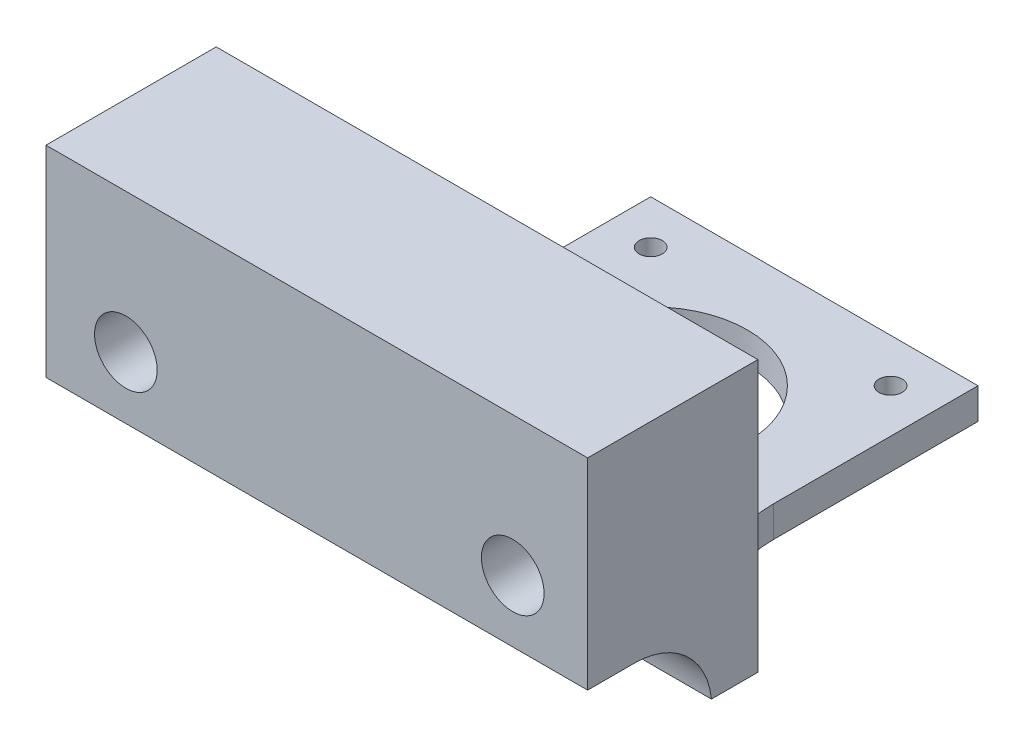
ISO-10303-21;
HEADER;
FILE_DESCRIPTION(('STEP AP214'),'2;1');
FILE_NAME('part.step','',(''),(''),'','','');
FILE_SCHEMA(('AUTOMOTIVE_DESIGN { 1 0 10303 214 1 1 1 1 }'));
ENDSEC;
DATA;
#1=APPLICATION_CONTEXT('core data for automotive mechanical design processes');
#2=APPLICATION_PROTOCOL_DEFINITION('international standard','automotive_design',2000,#1);
#3=PRODUCT_CONTEXT('',#1,'mechanical');
#4=PRODUCT('Part','Part','',(#3));
#5=PRODUCT_RELATED_PRODUCT_CATEGORY('part','',(#4));
#6=PRODUCT_DEFINITION_FORMATION('','',#4);
#7=PRODUCT_DEFINITION_CONTEXT('part definition',#1,'design');
#8=PRODUCT_DEFINITION('design','',#6,#7);
#9=PRODUCT_DEFINITION_SHAPE('','',#8);
#10=(LENGTH_UNIT() NAMED_UNIT(*) SI_UNIT(.MILLI.,.METRE.));
#11=(NAMED_UNIT(*) PLANE_ANGLE_UNIT() SI_UNIT($,.RADIAN.));
#12=(NAMED_UNIT(*) SI_UNIT($,.STERADIAN.) SOLID_ANGLE_UNIT());
#13=UNCERTAINTY_MEASURE_WITH_UNIT(LENGTH_MEASURE(1.E-05),#10,'distance_accuracy_value','');
#14=(GEOMETRIC_REPRESENTATION_CONTEXT(3) GLOBAL_UNCERTAINTY_ASSIGNED_CONTEXT((#13)) GLOBAL_UNIT_ASSIGNED_CONTEXT((#10,
#11,#12)) REPRESENTATION_CONTEXT('',''));
#15=CARTESIAN_POINT('',(0.,0.,0.));
#16=DIRECTION('',(0.,0.,1.));
#17=DIRECTION('',(1.,0.,0.));
#18=AXIS2_PLACEMENT_3D('',#15,#16,#17);
#19=CARTESIAN_POINT('',(0.,4.,0.));
#20=DIRECTION('',(0.,1.,0.));
#21=DIRECTION('',(0.,0.,1.));
#22=AXIS2_PLACEMENT_3D('',#19,#20,#21);
#23=PLANE('',#22);
#24=CARTESIAN_POINT('',(-15.5,4.,15.5));
#25=DIRECTION('',(0.,1.,0.));
#26=DIRECTION('',(0.,0.,1.));
#27=AXIS2_PLACEMENT_3D('',#24,#25,#26);
#28=CIRCLE('',#27,1.5);
#29=CARTESIAN_POINT('',(-15.5,4.,17.));
#30=VERTEX_POINT('',#29);
#31=EDGE_CURVE('E360',#30,#30,#28,.T.);
#32=ORIENTED_EDGE('',*,*,#31,.F.);
#33=EDGE_LOOP('',(#32));
#34=FACE_BOUND('',#33,.T.);
#35=CARTESIAN_POINT('',(-15.5,4.,-15.5));
#36=DIRECTION('',(0.,1.,0.));
#37=DIRECTION('',(0.,0.,1.));
#38=AXIS2_PLACEMENT_3D('',#35,#36,#37);
#39=CIRCLE('',#38,1.5);
#40=CARTESIAN_POINT('',(-15.5,4.,-14.));
#41=VERTEX_POINT('',#40);
#42=EDGE_CURVE('E372',#41,#41,#39,.T.);
#43=ORIENTED_EDGE('',*,*,#42,.F.);
#44=EDGE_LOOP('',(#43));
#45=FACE_BOUND('',#44,.T.);
#46=CARTESIAN_POINT('',(-37.15,4.,5.29511116406048));
#47=DIRECTION('',(0.,1.,0.));
#48=DIRECTION('',(0.,0.,1.));
#49=AXIS2_PLACEMENT_3D('',#46,#47,#48);
#50=CIRCLE('',#49,16.);
#51=CARTESIAN_POINT('',(-21.15,4.,5.29511116406048));
#52=VERTEX_POINT('',#51);
#53=CARTESIAN_POINT('',(-29.1473719726731,4.,19.15));
#54=VERTEX_POINT('',#53);
#55=EDGE_CURVE('E258',#52,#54,#50,.F.);
#56=ORIENTED_EDGE('',*,*,#55,.T.);
#57=DIRECTION('',(1.,0.,0.));
#58=VECTOR('',#57,1.);
#59=CARTESIAN_POINT('',(0.,4.,19.15));
#60=LINE('',#59,#58);
#61=CARTESIAN_POINT('',(29.1473719726731,4.,19.15));
#62=VERTEX_POINT('',#61);
#63=EDGE_CURVE('E266',#54,#62,#60,.T.);
#64=ORIENTED_EDGE('',*,*,#63,.T.);
#65=CARTESIAN_POINT('',(37.15,4.,5.29511116406048));
#66=DIRECTION('',(0.,1.,0.));
#67=DIRECTION('',(0.,0.,1.));
#68=AXIS2_PLACEMENT_3D('',#65,#66,#67);
#69=CIRCLE('',#68,16.);
#70=CARTESIAN_POINT('',(21.15,4.,5.29511116406048));
#71=VERTEX_POINT('',#70);
#72=EDGE_CURVE('E254',#62,#71,#69,.F.);
#73=ORIENTED_EDGE('',*,*,#72,.T.);
#74=DIRECTION('',(0.,0.,1.));
#75=VECTOR('',#74,1.);
#76=CARTESIAN_POINT('',(21.15,4.,-21.15));
#77=LINE('',#76,#75);
#78=CARTESIAN_POINT('',(21.15,4.,-21.15));
#79=VERTEX_POINT('',#78);
#80=EDGE_CURVE('E322',#79,#71,#77,.T.);
#81=ORIENTED_EDGE('',*,*,#80,.F.);
#82=DIRECTION('',(1.,0.,0.));
#83=VECTOR('',#82,1.);
#84=CARTESIAN_POINT('',(-21.15,4.,-21.15));
#85=LINE('',#84,#83);
#86=CARTESIAN_POINT('',(-21.15,4.,-21.15));
#87=VERTEX_POINT('',#86);
#88=EDGE_CURVE('E329',#87,#79,#85,.T.);
#89=ORIENTED_EDGE('',*,*,#88,.F.);
#90=DIRECTION('',(0.,0.,1.));
#91=VECTOR('',#90,1.);
#92=CARTESIAN_POINT('',(-21.15,4.,-21.15));
#93=LINE('',#92,#91);
#94=EDGE_CURVE('E330',#87,#52,#93,.T.);
#95=ORIENTED_EDGE('',*,*,#94,.T.);
#96=EDGE_LOOP('',(#56,#64,#73,#81,#89,#95));
#97=FACE_BOUND('',#96,.T.);
#98=CARTESIAN_POINT('',(0.,4.,0.));
#99=DIRECTION('',(0.,1.,0.));
#100=DIRECTION('',(0.,0.,1.));
#101=AXIS2_PLACEMENT_3D('',#98,#99,#100);
#102=CIRCLE('',#101,12.5);
#103=CARTESIAN_POINT('',(0.,4.,12.5));
#104=VERTEX_POINT('',#103);
#105=EDGE_CURVE('E378',#104,#104,#102,.T.);
#106=ORIENTED_EDGE('',*,*,#105,.F.);
#107=EDGE_LOOP('',(#106));
#108=FACE_BOUND('',#107,.T.);
#109=CARTESIAN_POINT('',(15.5,4.,15.5));
#110=DIRECTION('',(0.,1.,0.));
#111=DIRECTION('',(0.,0.,1.));
#112=AXIS2_PLACEMENT_3D('',#109,#110,#111);
#113=CIRCLE('',#112,1.5);
#114=CARTESIAN_POINT('',(15.5,4.,17.));
#115=VERTEX_POINT('',#114);
#116=EDGE_CURVE('E366',#115,#115,#113,.T.);
#117=ORIENTED_EDGE('',*,*,#116,.F.);
#118=EDGE_LOOP('',(#117));
#119=FACE_BOUND('',#118,.T.);
#120=CARTESIAN_POINT('',(15.5,4.,-15.5));
#121=DIRECTION('',(0.,1.,0.));
#122=DIRECTION('',(0.,0.,1.));
#123=AXIS2_PLACEMENT_3D('',#120,#121,#122);
#124=CIRCLE('',#123,1.5);
#125=CARTESIAN_POINT('',(15.5,4.,-14.));
#126=VERTEX_POINT('',#125);
#127=EDGE_CURVE('E354',#126,#126,#124,.T.);
#128=ORIENTED_EDGE('',*,*,#127,.F.);
#129=EDGE_LOOP('',(#128));
#130=FACE_BOUND('',#129,.T.);
#131=ADVANCED_FACE('F110',(#34,#45,#97,#108,#119,#130),#23,.T.);
#132=CARTESIAN_POINT('',(0.,0.,0.));
#133=DIRECTION('',(0.,1.,0.));
#134=DIRECTION('',(0.,0.,1.));
#135=AXIS2_PLACEMENT_3D('',#132,#133,#134);
#136=PLANE('',#135);
#137=CARTESIAN_POINT('',(-15.5,0.,15.5));
#138=DIRECTION('',(0.,1.,0.));
#139=DIRECTION('',(0.,0.,1.));
#140=AXIS2_PLACEMENT_3D('',#137,#138,#139);
#141=CIRCLE('',#140,1.5);
#142=CARTESIAN_POINT('',(-15.5,0.,17.));
#143=VERTEX_POINT('',#142);
#144=EDGE_CURVE('E357',#143,#143,#141,.T.);
#145=ORIENTED_EDGE('',*,*,#144,.T.);
#146=EDGE_LOOP('',(#145));
#147=FACE_BOUND('',#146,.T.);
#148=CARTESIAN_POINT('',(-15.5,0.,-15.5));
#149=DIRECTION('',(0.,1.,0.));
#150=DIRECTION('',(0.,0.,1.));
#151=AXIS2_PLACEMENT_3D('',#148,#149,#150);
#152=CIRCLE('',#151,1.5);
#153=CARTESIAN_POINT('',(-15.5,0.,-14.));
#154=VERTEX_POINT('',#153);
#155=EDGE_CURVE('E369',#154,#154,#152,.T.);
#156=ORIENTED_EDGE('',*,*,#155,.T.);
#157=EDGE_LOOP('',(#156));
#158=FACE_BOUND('',#157,.T.);
#159=DIRECTION('',(0.,0.,1.));
#160=VECTOR('',#159,1.);
#161=CARTESIAN_POINT('',(-21.15,0.,-21.15));
#162=LINE('',#161,#160);
#163=CARTESIAN_POINT('',(-21.15,0.,-21.15));
#164=VERTEX_POINT('',#163);
#165=CARTESIAN_POINT('',(-21.15,0.,5.29511116406048));
#166=VERTEX_POINT('',#165);
#167=EDGE_CURVE('E381',#164,#166,#162,.T.);
#168=ORIENTED_EDGE('',*,*,#167,.F.);
#169=DIRECTION('',(1.,0.,0.));
#170=VECTOR('',#169,1.);
#171=CARTESIAN_POINT('',(-21.15,0.,-21.15));
#172=LINE('',#171,#170);
#173=CARTESIAN_POINT('',(21.15,0.,-21.15));
#174=VERTEX_POINT('',#173);
#175=EDGE_CURVE('E385',#164,#174,#172,.T.);
#176=ORIENTED_EDGE('',*,*,#175,.T.);
#177=DIRECTION('',(0.,0.,1.));
#178=VECTOR('',#177,1.);
#179=CARTESIAN_POINT('',(21.15,0.,-21.15));
#180=LINE('',#179,#178);
#181=CARTESIAN_POINT('',(21.15,0.,5.29511116406048));
#182=VERTEX_POINT('',#181);
#183=EDGE_CURVE('E341',#174,#182,#180,.T.);
#184=ORIENTED_EDGE('',*,*,#183,.T.);
#185=CARTESIAN_POINT('',(37.15,0.,5.29511116406048));
#186=DIRECTION('',(0.,1.,0.));
#187=DIRECTION('',(0.,0.,1.));
#188=AXIS2_PLACEMENT_3D('',#185,#186,#187);
#189=CIRCLE('',#188,16.);
#190=CARTESIAN_POINT('',(35.,0.,21.15));
#191=VERTEX_POINT('',#190);
#192=EDGE_CURVE('E252',#182,#191,#189,.T.);
#193=ORIENTED_EDGE('',*,*,#192,.T.);
#194=DIRECTION('',(0.,0.,-1.));
#195=VECTOR('',#194,1.);
#196=CARTESIAN_POINT('',(35.,0.,27.15));
#197=LINE('',#196,#195);
#198=CARTESIAN_POINT('',(35.,0.,27.15));
#199=VERTEX_POINT('',#198);
#200=EDGE_CURVE('E338',#199,#191,#197,.T.);
#201=ORIENTED_EDGE('',*,*,#200,.F.);
#202=DIRECTION('',(1.,0.,0.));
#203=VECTOR('',#202,1.);
#204=CARTESIAN_POINT('',(0.,0.,27.15));
#205=LINE('',#204,#203);
#206=CARTESIAN_POINT('',(-35.,0.,27.15));
#207=VERTEX_POINT('',#206);
#208=EDGE_CURVE('E413',#207,#199,#205,.T.);
#209=ORIENTED_EDGE('',*,*,#208,.F.);
#210=DIRECTION('',(0.,0.,-1.));
#211=VECTOR('',#210,1.);
#212=CARTESIAN_POINT('',(-35.,0.,27.15));
#213=LINE('',#212,#211);
#214=CARTESIAN_POINT('',(-35.,0.,21.15));
#215=VERTEX_POINT('',#214);
#216=EDGE_CURVE('E343',#207,#215,#213,.T.);
#217=ORIENTED_EDGE('',*,*,#216,.T.);
#218=CARTESIAN_POINT('',(-37.15,0.,5.29511116406048));
#219=DIRECTION('',(0.,1.,0.));
#220=DIRECTION('',(0.,0.,1.));
#221=AXIS2_PLACEMENT_3D('',#218,#219,#220);
#222=CIRCLE('',#221,16.);
#223=EDGE_CURVE('E256',#215,#166,#222,.T.);
#224=ORIENTED_EDGE('',*,*,#223,.T.);
#225=EDGE_LOOP('',(#168,#176,#184,#193,#201,#209,#217,#224));
#226=FACE_BOUND('',#225,.T.);
#227=CARTESIAN_POINT('',(0.,0.,0.));
#228=DIRECTION('',(0.,1.,0.));
#229=DIRECTION('',(0.,0.,1.));
#230=AXIS2_PLACEMENT_3D('',#227,#228,#229);
#231=CIRCLE('',#230,12.5);
#232=CARTESIAN_POINT('',(0.,0.,12.5));
#233=VERTEX_POINT('',#232);
#234=EDGE_CURVE('E375',#233,#233,#231,.T.);
#235=ORIENTED_EDGE('',*,*,#234,.T.);
#236=EDGE_LOOP('',(#235));
#237=FACE_BOUND('',#236,.T.);
#238=CARTESIAN_POINT('',(15.5,0.,15.5));
#239=DIRECTION('',(0.,1.,0.));
#240=DIRECTION('',(0.,0.,1.));
#241=AXIS2_PLACEMENT_3D('',#238,#239,#240);
#242=CIRCLE('',#241,1.5);
#243=CARTESIAN_POINT('',(15.5,0.,17.));
#244=VERTEX_POINT('',#243);
#245=EDGE_CURVE('E363',#244,#244,#242,.T.);
#246=ORIENTED_EDGE('',*,*,#245,.T.);
#247=EDGE_LOOP('',(#246));
#248=FACE_BOUND('',#247,.T.);
#249=CARTESIAN_POINT('',(15.5,0.,-15.5));
#250=DIRECTION('',(0.,1.,0.));
#251=DIRECTION('',(0.,0.,1.));
#252=AXIS2_PLACEMENT_3D('',#249,#250,#251);
#253=CIRCLE('',#252,1.5);
#254=CARTESIAN_POINT('',(15.5,0.,-14.));
#255=VERTEX_POINT('',#254);
#256=EDGE_CURVE('E347',#255,#255,#253,.T.);
#257=ORIENTED_EDGE('',*,*,#256,.T.);
#258=EDGE_LOOP('',(#257));
#259=FACE_BOUND('',#258,.T.);
#260=ADVANCED_FACE('F296',(#147,#158,#226,#237,#248,#259),#136,.F.);
#261=CARTESIAN_POINT('',(-21.15,4.,-21.15));
#262=DIRECTION('',(1.,0.,0.));
#263=DIRECTION('',(0.,0.,-1.));
#264=AXIS2_PLACEMENT_3D('',#261,#262,#263);
#265=PLANE('',#264);
#266=ORIENTED_EDGE('',*,*,#167,.T.);
#267=DIRECTION('',(0.,-1.,0.));
#268=VECTOR('',#267,1.);
#269=CARTESIAN_POINT('',(-21.15,4.,5.29511116406048));
#270=LINE('',#269,#268);
#271=EDGE_CURVE('E249',#166,#52,#270,.F.);
#272=ORIENTED_EDGE('',*,*,#271,.T.);
#273=ORIENTED_EDGE('',*,*,#94,.F.);
#274=DIRECTION('',(0.,-1.,0.));
#275=VECTOR('',#274,1.);
#276=CARTESIAN_POINT('',(-21.15,4.,-21.15));
#277=LINE('',#276,#275);
#278=EDGE_CURVE('E388',#87,#164,#277,.T.);
#279=ORIENTED_EDGE('',*,*,#278,.T.);
#280=EDGE_LOOP('',(#266,#272,#273,#279));
#281=FACE_BOUND('',#280,.T.);
#282=ADVANCED_FACE('F283',(#281),#265,.F.);
#283=CARTESIAN_POINT('',(21.15,4.,-21.15));
#284=DIRECTION('',(1.,0.,0.));
#285=DIRECTION('',(0.,0.,-1.));
#286=AXIS2_PLACEMENT_3D('',#283,#284,#285);
#287=PLANE('',#286);
#288=ORIENTED_EDGE('',*,*,#80,.T.);
#289=DIRECTION('',(0.,1.,0.));
#290=VECTOR('',#289,1.);
#291=CARTESIAN_POINT('',(21.15,0.,5.29511116406048));
#292=LINE('',#291,#290);
#293=EDGE_CURVE('E246',#71,#182,#292,.F.);
#294=ORIENTED_EDGE('',*,*,#293,.T.);
#295=ORIENTED_EDGE('',*,*,#183,.F.);
#296=DIRECTION('',(0.,-1.,0.));
#297=VECTOR('',#296,1.);
#298=CARTESIAN_POINT('',(21.15,4.,-21.15));
#299=LINE('',#298,#297);
#300=EDGE_CURVE('E250',#79,#174,#299,.T.);
#301=ORIENTED_EDGE('',*,*,#300,.F.);
#302=EDGE_LOOP('',(#288,#294,#295,#301));
#303=FACE_BOUND('',#302,.T.);
#304=ADVANCED_FACE('F312',(#303),#287,.T.);
#305=CARTESIAN_POINT('',(-21.15,4.,-21.15));
#306=DIRECTION('',(0.,0.,-1.));
#307=DIRECTION('',(-1.,0.,0.));
#308=AXIS2_PLACEMENT_3D('',#305,#306,#307);
#309=PLANE('',#308);
#310=ORIENTED_EDGE('',*,*,#175,.F.);
#311=ORIENTED_EDGE('',*,*,#278,.F.);
#312=ORIENTED_EDGE('',*,*,#88,.T.);
#313=ORIENTED_EDGE('',*,*,#300,.T.);
#314=EDGE_LOOP('',(#310,#311,#312,#313));
#315=FACE_BOUND('',#314,.T.);
#316=ADVANCED_FACE('F310',(#315),#309,.T.);
#317=CARTESIAN_POINT('',(0.,4.,0.));
#318=DIRECTION('',(0.,-1.,0.));
#319=DIRECTION('',(0.,0.,-1.));
#320=AXIS2_PLACEMENT_3D('',#317,#318,#319);
#321=CYLINDRICAL_SURFACE('',#320,12.5);
#322=ORIENTED_EDGE('',*,*,#105,.T.);
#323=EDGE_LOOP('',(#322));
#324=FACE_BOUND('',#323,.T.);
#325=ORIENTED_EDGE('',*,*,#234,.F.);
#326=EDGE_LOOP('',(#325));
#327=FACE_BOUND('',#326,.T.);
#328=ADVANCED_FACE('F307',(#324,#327),#321,.F.);
#329=CARTESIAN_POINT('',(-15.5,4.,-15.5));
#330=DIRECTION('',(0.,-1.,0.));
#331=DIRECTION('',(0.,0.,-1.));
#332=AXIS2_PLACEMENT_3D('',#329,#330,#331);
#333=CYLINDRICAL_SURFACE('',#332,1.5);
#334=ORIENTED_EDGE('',*,*,#42,.T.);
#335=EDGE_LOOP('',(#334));
#336=FACE_BOUND('',#335,.T.);
#337=ORIENTED_EDGE('',*,*,#155,.F.);
#338=EDGE_LOOP('',(#337));
#339=FACE_BOUND('',#338,.T.);
#340=ADVANCED_FACE('F459',(#336,#339),#333,.F.);
#341=CARTESIAN_POINT('',(15.5,4.,15.5));
#342=DIRECTION('',(0.,-1.,0.));
#343=DIRECTION('',(0.,0.,-1.));
#344=AXIS2_PLACEMENT_3D('',#341,#342,#343);
#345=CYLINDRICAL_SURFACE('',#344,1.5);
#346=ORIENTED_EDGE('',*,*,#116,.T.);
#347=EDGE_LOOP('',(#346));
#348=FACE_BOUND('',#347,.T.);
#349=ORIENTED_EDGE('',*,*,#245,.F.);
#350=EDGE_LOOP('',(#349));
#351=FACE_BOUND('',#350,.T.);
#352=ADVANCED_FACE('F456',(#348,#351),#345,.F.);
#353=CARTESIAN_POINT('',(-15.5,4.,15.5));
#354=DIRECTION('',(0.,-1.,0.));
#355=DIRECTION('',(0.,0.,-1.));
#356=AXIS2_PLACEMENT_3D('',#353,#354,#355);
#357=CYLINDRICAL_SURFACE('',#356,1.5);
#358=ORIENTED_EDGE('',*,*,#31,.T.);
#359=EDGE_LOOP('',(#358));
#360=FACE_BOUND('',#359,.T.);
#361=ORIENTED_EDGE('',*,*,#144,.F.);
#362=EDGE_LOOP('',(#361));
#363=FACE_BOUND('',#362,.T.);
#364=ADVANCED_FACE('F452',(#360,#363),#357,.F.);
#365=CARTESIAN_POINT('',(15.5,4.,-15.5));
#366=DIRECTION('',(0.,-1.,0.));
#367=DIRECTION('',(0.,0.,-1.));
#368=AXIS2_PLACEMENT_3D('',#365,#366,#367);
#369=CYLINDRICAL_SURFACE('',#368,1.5);
#370=ORIENTED_EDGE('',*,*,#127,.T.);
#371=EDGE_LOOP('',(#370));
#372=FACE_BOUND('',#371,.T.);
#373=ORIENTED_EDGE('',*,*,#256,.F.);
#374=EDGE_LOOP('',(#373));
#375=FACE_BOUND('',#374,.T.);
#376=ADVANCED_FACE('F449',(#372,#375),#369,.F.);
#377=CARTESIAN_POINT('',(-35.,0.,27.15));
#378=DIRECTION('',(-1.,0.,0.));
#379=DIRECTION('',(0.,-1.,0.));
#380=AXIS2_PLACEMENT_3D('',#377,#378,#379);
#381=PLANE('',#380);
#382=DIRECTION('',(0.,1.,0.));
#383=VECTOR('',#382,1.);
#384=CARTESIAN_POINT('',(-35.,0.,21.15));
#385=LINE('',#384,#383);
#386=CARTESIAN_POINT('',(-35.,6.,21.15));
#387=VERTEX_POINT('',#386);
#388=EDGE_CURVE('E231',#215,#387,#385,.T.);
#389=ORIENTED_EDGE('',*,*,#388,.F.);
#390=ORIENTED_EDGE('',*,*,#216,.F.);
#391=CARTESIAN_POINT('',(-35.,-0.999999999999996,37.0998743710662));
#392=DIRECTION('',(-1.,0.,0.));
#393=DIRECTION('',(0.,-1.,0.));
#394=AXIS2_PLACEMENT_3D('',#391,#392,#393);
#395=CIRCLE('',#394,10.);
#396=CARTESIAN_POINT('',(-35.,9.00000000000001,37.0998743710662));
#397=VERTEX_POINT('',#396);
#398=EDGE_CURVE('E228',#207,#397,#395,.F.);
#399=ORIENTED_EDGE('',*,*,#398,.T.);
#400=DIRECTION('',(0.,0.,-1.));
#401=VECTOR('',#400,1.);
#402=CARTESIAN_POINT('',(-35.,9.00000000000001,43.15));
#403=LINE('',#402,#401);
#404=CARTESIAN_POINT('',(-35.,9.00000000000001,43.15));
#405=VERTEX_POINT('',#404);
#406=EDGE_CURVE('E205',#405,#397,#403,.T.);
#407=ORIENTED_EDGE('',*,*,#406,.F.);
#408=DIRECTION('',(0.,-1.,0.));
#409=VECTOR('',#408,1.);
#410=CARTESIAN_POINT('',(-35.,35.,43.15));
#411=LINE('',#410,#409);
#412=CARTESIAN_POINT('',(-35.,35.,43.15));
#413=VERTEX_POINT('',#412);
#414=EDGE_CURVE('E213',#413,#405,#411,.T.);
#415=ORIENTED_EDGE('',*,*,#414,.F.);
#416=DIRECTION('',(0.,0.,-1.));
#417=VECTOR('',#416,1.);
#418=CARTESIAN_POINT('',(-35.,35.,27.15));
#419=LINE('',#418,#417);
#420=CARTESIAN_POINT('',(-35.,35.,21.15));
#421=VERTEX_POINT('',#420);
#422=EDGE_CURVE('E350',#413,#421,#419,.T.);
#423=ORIENTED_EDGE('',*,*,#422,.T.);
#424=EDGE_CURVE('E229',#387,#421,#385,.T.);
#425=ORIENTED_EDGE('',*,*,#424,.F.);
#426=EDGE_LOOP('',(#389,#390,#399,#407,#415,#423,#425));
#427=FACE_BOUND('',#426,.T.);
#428=ADVANCED_FACE('F226',(#427),#381,.T.);
#429=CARTESIAN_POINT('',(35.,0.,27.15));
#430=DIRECTION('',(-1.,0.,0.));
#431=DIRECTION('',(0.,0.,1.));
#432=AXIS2_PLACEMENT_3D('',#429,#430,#431);
#433=PLANE('',#432);
#434=DIRECTION('',(0.,1.,0.));
#435=VECTOR('',#434,1.);
#436=CARTESIAN_POINT('',(35.,0.,21.15));
#437=LINE('',#436,#435);
#438=CARTESIAN_POINT('',(35.,6.,21.15));
#439=VERTEX_POINT('',#438);
#440=EDGE_CURVE('E130',#191,#439,#437,.T.);
#441=ORIENTED_EDGE('',*,*,#440,.T.);
#442=CARTESIAN_POINT('',(35.,35.,21.15));
#443=VERTEX_POINT('',#442);
#444=EDGE_CURVE('E410',#439,#443,#437,.T.);
#445=ORIENTED_EDGE('',*,*,#444,.T.);
#446=DIRECTION('',(0.,0.,-1.));
#447=VECTOR('',#446,1.);
#448=CARTESIAN_POINT('',(35.,35.,27.15));
#449=LINE('',#448,#447);
#450=CARTESIAN_POINT('',(35.,35.,43.15));
#451=VERTEX_POINT('',#450);
#452=EDGE_CURVE('E344',#451,#443,#449,.T.);
#453=ORIENTED_EDGE('',*,*,#452,.F.);
#454=DIRECTION('',(0.,1.,0.));
#455=VECTOR('',#454,1.);
#456=CARTESIAN_POINT('',(35.,35.,43.15));
#457=LINE('',#456,#455);
#458=CARTESIAN_POINT('',(35.,9.00000000000001,43.15));
#459=VERTEX_POINT('',#458);
#460=EDGE_CURVE('E212',#459,#451,#457,.T.);
#461=ORIENTED_EDGE('',*,*,#460,.F.);
#462=DIRECTION('',(0.,0.,-1.));
#463=VECTOR('',#462,1.);
#464=CARTESIAN_POINT('',(35.,9.00000000000001,43.15));
#465=LINE('',#464,#463);
#466=CARTESIAN_POINT('',(35.,9.00000000000001,37.0998743710662));
#467=VERTEX_POINT('',#466);
#468=EDGE_CURVE('E208',#459,#467,#465,.T.);
#469=ORIENTED_EDGE('',*,*,#468,.T.);
#470=CARTESIAN_POINT('',(35.,-0.999999999999996,37.0998743710662));
#471=DIRECTION('',(-1.,0.,0.));
#472=DIRECTION('',(0.,0.,1.));
#473=AXIS2_PLACEMENT_3D('',#470,#471,#472);
#474=CIRCLE('',#473,10.);
#475=EDGE_CURVE('E263',#467,#199,#474,.T.);
#476=ORIENTED_EDGE('',*,*,#475,.T.);
#477=ORIENTED_EDGE('',*,*,#200,.T.);
#478=EDGE_LOOP('',(#441,#445,#453,#461,#469,#476,#477));
#479=FACE_BOUND('',#478,.T.);
#480=ADVANCED_FACE('F342',(#479),#433,.F.);
#481=CARTESIAN_POINT('',(0.,35.,27.15));
#482=DIRECTION('',(0.,1.,0.));
#483=DIRECTION('',(0.,0.,1.));
#484=AXIS2_PLACEMENT_3D('',#481,#482,#483);
#485=PLANE('',#484);
#486=DIRECTION('',(1.,0.,0.));
#487=VECTOR('',#486,1.);
#488=CARTESIAN_POINT('',(0.,35.,21.15));
#489=LINE('',#488,#487);
#490=EDGE_CURVE('E414',#421,#443,#489,.T.);
#491=ORIENTED_EDGE('',*,*,#490,.F.);
#492=ORIENTED_EDGE('',*,*,#422,.F.);
#493=DIRECTION('',(-1.,0.,0.));
#494=VECTOR('',#493,1.);
#495=CARTESIAN_POINT('',(-35.,35.,43.15));
#496=LINE('',#495,#494);
#497=EDGE_CURVE('E220',#451,#413,#496,.T.);
#498=ORIENTED_EDGE('',*,*,#497,.F.);
#499=ORIENTED_EDGE('',*,*,#452,.T.);
#500=EDGE_LOOP('',(#491,#492,#498,#499));
#501=FACE_BOUND('',#500,.T.);
#502=ADVANCED_FACE('F415',(#501),#485,.T.);
#503=CARTESIAN_POINT('',(0.,0.,21.15));
#504=DIRECTION('',(0.,0.,1.));
#505=DIRECTION('',(1.,0.,0.));
#506=AXIS2_PLACEMENT_3D('',#503,#504,#505);
#507=PLANE('',#506);
#508=CARTESIAN_POINT('',(25.3209634714259,17.,21.15));
#509=DIRECTION('',(0.,0.,1.));
#510=DIRECTION('',(1.,0.,0.));
#511=AXIS2_PLACEMENT_3D('',#508,#509,#510);
#512=CIRCLE('',#511,4.05);
#513=CARTESIAN_POINT('',(29.3709634714259,17.,21.15));
#514=VERTEX_POINT('',#513);
#515=EDGE_CURVE('E243',#514,#514,#512,.T.);
#516=ORIENTED_EDGE('',*,*,#515,.T.);
#517=EDGE_LOOP('',(#516));
#518=FACE_BOUND('',#517,.T.);
#519=CARTESIAN_POINT('',(-24.6790365285741,17.,21.15));
#520=DIRECTION('',(0.,0.,1.));
#521=DIRECTION('',(1.,0.,0.));
#522=AXIS2_PLACEMENT_3D('',#519,#520,#521);
#523=CIRCLE('',#522,4.05);
#524=CARTESIAN_POINT('',(-20.6290365285741,17.,21.15));
#525=VERTEX_POINT('',#524);
#526=EDGE_CURVE('E239',#525,#525,#523,.T.);
#527=ORIENTED_EDGE('',*,*,#526,.T.);
#528=EDGE_LOOP('',(#527));
#529=FACE_BOUND('',#528,.T.);
#530=ORIENTED_EDGE('',*,*,#444,.F.);
#531=DIRECTION('',(1.,0.,0.));
#532=VECTOR('',#531,1.);
#533=CARTESIAN_POINT('',(0.,6.,21.15));
#534=LINE('',#533,#532);
#535=EDGE_CURVE('E269',#439,#387,#534,.F.);
#536=ORIENTED_EDGE('',*,*,#535,.T.);
#537=ORIENTED_EDGE('',*,*,#424,.T.);
#538=ORIENTED_EDGE('',*,*,#490,.T.);
#539=EDGE_LOOP('',(#530,#536,#537,#538));
#540=FACE_BOUND('',#539,.T.);
#541=ADVANCED_FACE('F408',(#518,#529,#540),#507,.F.);
#542=CARTESIAN_POINT('',(0.,0.,43.15));
#543=DIRECTION('',(0.,0.,1.));
#544=DIRECTION('',(1.,0.,0.));
#545=AXIS2_PLACEMENT_3D('',#542,#543,#544);
#546=PLANE('',#545);
#547=CARTESIAN_POINT('',(-24.6790365285741,17.,43.15));
#548=DIRECTION('',(0.,0.,1.));
#549=DIRECTION('',(1.,0.,0.));
#550=AXIS2_PLACEMENT_3D('',#547,#548,#549);
#551=CIRCLE('',#550,4.05);
#552=CARTESIAN_POINT('',(-20.6290365285741,17.,43.15));
#553=VERTEX_POINT('',#552);
#554=EDGE_CURVE('E223',#553,#553,#551,.T.);
#555=ORIENTED_EDGE('',*,*,#554,.F.);
#556=EDGE_LOOP('',(#555));
#557=FACE_BOUND('',#556,.T.);
#558=ORIENTED_EDGE('',*,*,#414,.T.);
#559=DIRECTION('',(1.,0.,0.));
#560=VECTOR('',#559,1.);
#561=CARTESIAN_POINT('',(-35.,9.00000000000001,43.15));
#562=LINE('',#561,#560);
#563=EDGE_CURVE('E200',#405,#459,#562,.T.);
#564=ORIENTED_EDGE('',*,*,#563,.T.);
#565=ORIENTED_EDGE('',*,*,#460,.T.);
#566=ORIENTED_EDGE('',*,*,#497,.T.);
#567=EDGE_LOOP('',(#558,#564,#565,#566));
#568=FACE_BOUND('',#567,.T.);
#569=CARTESIAN_POINT('',(25.3209634714259,17.,43.15));
#570=DIRECTION('',(0.,0.,1.));
#571=DIRECTION('',(1.,0.,0.));
#572=AXIS2_PLACEMENT_3D('',#569,#570,#571);
#573=CIRCLE('',#572,4.05);
#574=CARTESIAN_POINT('',(29.3709634714259,17.,43.15));
#575=VERTEX_POINT('',#574);
#576=EDGE_CURVE('E242',#575,#575,#573,.T.);
#577=ORIENTED_EDGE('',*,*,#576,.F.);
#578=EDGE_LOOP('',(#577));
#579=FACE_BOUND('',#578,.T.);
#580=ADVANCED_FACE('F217',(#557,#568,#579),#546,.T.);
#581=CARTESIAN_POINT('',(-35.,9.00000000000001,43.15));
#582=DIRECTION('',(0.,1.,0.));
#583=DIRECTION('',(0.,0.,1.));
#584=AXIS2_PLACEMENT_3D('',#581,#582,#583);
#585=PLANE('',#584);
#586=ORIENTED_EDGE('',*,*,#406,.T.);
#587=DIRECTION('',(-1.,0.,0.));
#588=VECTOR('',#587,1.);
#589=CARTESIAN_POINT('',(-35.,9.00000000000001,37.0998743710662));
#590=LINE('',#589,#588);
#591=EDGE_CURVE('E261',#397,#467,#590,.F.);
#592=ORIENTED_EDGE('',*,*,#591,.T.);
#593=ORIENTED_EDGE('',*,*,#468,.F.);
#594=ORIENTED_EDGE('',*,*,#563,.F.);
#595=EDGE_LOOP('',(#586,#592,#593,#594));
#596=FACE_BOUND('',#595,.T.);
#597=ADVANCED_FACE('F202',(#596),#585,.F.);
#598=CARTESIAN_POINT('',(-24.6790365285741,17.,43.15));
#599=DIRECTION('',(0.,0.,-1.));
#600=DIRECTION('',(-1.,0.,0.));
#601=AXIS2_PLACEMENT_3D('',#598,#599,#600);
#602=CYLINDRICAL_SURFACE('',#601,4.05);
#603=ORIENTED_EDGE('',*,*,#554,.T.);
#604=EDGE_LOOP('',(#603));
#605=FACE_BOUND('',#604,.T.);
#606=ORIENTED_EDGE('',*,*,#526,.F.);
#607=EDGE_LOOP('',(#606));
#608=FACE_BOUND('',#607,.T.);
#609=ADVANCED_FACE('F435',(#605,#608),#602,.F.);
#610=CARTESIAN_POINT('',(25.3209634714259,17.,43.15));
#611=DIRECTION('',(0.,0.,-1.));
#612=DIRECTION('',(-1.,0.,0.));
#613=AXIS2_PLACEMENT_3D('',#610,#611,#612);
#614=CYLINDRICAL_SURFACE('',#613,4.05);
#615=ORIENTED_EDGE('',*,*,#576,.T.);
#616=EDGE_LOOP('',(#615));
#617=FACE_BOUND('',#616,.T.);
#618=ORIENTED_EDGE('',*,*,#515,.F.);
#619=EDGE_LOOP('',(#618));
#620=FACE_BOUND('',#619,.T.);
#621=ADVANCED_FACE('F281',(#617,#620),#614,.F.);
#622=CARTESIAN_POINT('',(37.15,0.,5.29511116406048));
#623=DIRECTION('',(0.,-1.,0.));
#624=DIRECTION('',(0.,0.,-1.));
#625=AXIS2_PLACEMENT_3D('',#622,#623,#624);
#626=CYLINDRICAL_SURFACE('',#625,16.);
#627=ORIENTED_EDGE('',*,*,#72,.F.);
#628=CARTESIAN_POINT('',(29.1473719726731,4.,19.15));
#629=CARTESIAN_POINT('',(29.2547153999083,4.0000173523689,19.2120054565976));
#630=CARTESIAN_POINT('',(29.3627586342961,4.00288267272583,19.2727444233398));
#631=CARTESIAN_POINT('',(29.5799877171632,4.01374268787837,19.3915720201303));
#632=CARTESIAN_POINT('',(29.6891731034207,4.02173538107547,19.4496616749301));
#633=CARTESIAN_POINT('',(29.908361761581,4.04227025182999,19.5630432851146));
#634=CARTESIAN_POINT('',(30.0183636920118,4.05480611604647,19.6183390021383));
#635=CARTESIAN_POINT('',(30.2391765633426,4.08397785253972,19.7261756024571));
#636=CARTESIAN_POINT('',(30.3499875919766,4.10061417605128,19.7787161817911));
#637=CARTESIAN_POINT('',(30.6850988464534,4.1563508199341,19.9329323592538));
#638=CARTESIAN_POINT('',(30.9104394718621,4.2011138696394,20.0303561086928));
#639=CARTESIAN_POINT('',(31.3628915904491,4.3031700201111,20.2138580970452));
#640=CARTESIAN_POINT('',(31.5900034981795,4.3604661444982,20.2999335901318));
#641=CARTESIAN_POINT('',(32.0200506444613,4.47909106738493,20.4519492600826));
#642=CARTESIAN_POINT('',(32.2228894131102,4.53927793257073,20.5190631642266));
#643=CARTESIAN_POINT('',(32.6287938023133,4.66787532851686,20.6445022902632));
#644=CARTESIAN_POINT('',(32.8318594816757,4.73628920691969,20.7028239125986));
#645=CARTESIAN_POINT('',(33.1354085465213,4.84531237226622,20.7836220939407));
#646=CARTESIAN_POINT('',(33.236211643926,4.88263768701492,20.8093948670873));
#647=CARTESIAN_POINT('',(33.4374202106344,4.95970946381804,20.8587699430038));
#648=CARTESIAN_POINT('',(33.5378257128734,4.99945572066503,20.8823724293104));
#649=CARTESIAN_POINT('',(33.7378502021461,5.0817792888872,20.9273769797075));
#650=CARTESIAN_POINT('',(33.8374698560652,5.12435382441909,20.948781150312));
#651=CARTESIAN_POINT('',(34.0354984946358,5.21318296657892,20.9893799329331));
#652=CARTESIAN_POINT('',(34.1339079044636,5.25943623554416,21.0085753419446));
#653=CARTESIAN_POINT('',(34.2856504709742,5.33584970740678,21.0367305833105));
#654=CARTESIAN_POINT('',(34.3397759383668,5.36414264058471,21.0464795726154));
#655=CARTESIAN_POINT('',(34.4469842108006,5.42306441121652,21.0652304477333));
#656=CARTESIAN_POINT('',(34.5000656622211,5.45369605831574,21.0742314069055));
#657=CARTESIAN_POINT('',(34.601718803242,5.51658953513828,21.0909582510976));
#658=CARTESIAN_POINT('',(34.6503828261638,5.5486907082292,21.0987255892259));
#659=CARTESIAN_POINT('',(34.7446947838616,5.61725410579995,21.1133521007184));
#660=CARTESIAN_POINT('',(34.7903500098504,5.65370513705352,21.1202135132402));
#661=CARTESIAN_POINT('',(34.8509691985315,5.71101955582659,21.129087502667));
#662=CARTESIAN_POINT('',(34.8686043589779,5.72893780559432,21.1316361130853));
#663=CARTESIAN_POINT('',(34.9020398026324,5.76652482799306,21.1364165651886));
#664=CARTESIAN_POINT('',(34.9178384691358,5.78619511647991,21.1386481281484));
#665=CARTESIAN_POINT('',(34.9441014248207,5.82409590144791,21.1423240822308));
#666=CARTESIAN_POINT('',(34.9550159689981,5.84200168676187,21.1438378057541));
#667=CARTESIAN_POINT('',(34.973887126097,5.87928026889544,21.1464399145525));
#668=CARTESIAN_POINT('',(34.9818599375937,5.89864430277807,21.1475306308584));
#669=CARTESIAN_POINT('',(34.9917368050857,5.93174466878503,21.14887780978));
#670=CARTESIAN_POINT('',(34.9947846792347,5.94513020941316,21.1492921325029));
#671=CARTESIAN_POINT('',(34.9989394569923,5.97233055994787,21.1498561968986));
#672=CARTESIAN_POINT('',(35.0000276060102,5.98614824338909,21.1500033821658));
#673=CARTESIAN_POINT('',(35.,6.00000000000001,21.15));
#674=B_SPLINE_CURVE_WITH_KNOTS('',3,(#628,#629,#630,#631,#632,#633,#634,#635,#636,#637,#638,
#639,#640,#641,#642,#643,#644,#645,#646,#647,#648,#649,#650,#651,#652,#653,#654,#655,#656,#657,
#658,#659,#660,#661,#662,#663,#664,#665,#666,#667,#668,#669,#670,#671,#672,#673),.UNSPECIFIED.,
.F.,.F.,(4,2,2,2,2,2,2,2,2,2,2,2,2,2,2,2,2,2,2,2,2,2,4),(0.,0.371813759106193,0.743482459644284,
1.114636645098,1.48583169244039,2.23375921612228,2.98186737769781,3.64745653683389,
4.31331745224,4.64489491687499,4.97644431486123,5.30767298517349,5.63878175982893,
5.8242890131988,6.01002274526823,6.18636851041462,6.36226990289071,6.43799457876146,
6.51378541977118,6.57667732207361,6.63921755223109,6.68028253967761,6.72173847240122),.UNSPECIFIED.);
#675=EDGE_CURVE('E124',#62,#439,#674,.T.);
#676=ORIENTED_EDGE('',*,*,#675,.T.);
#677=ORIENTED_EDGE('',*,*,#440,.F.);
#678=ORIENTED_EDGE('',*,*,#192,.F.);
#679=ORIENTED_EDGE('',*,*,#293,.F.);
#680=EDGE_LOOP('',(#627,#676,#677,#678,#679));
#681=FACE_BOUND('',#680,.T.);
#682=ADVANCED_FACE('F276',(#681),#626,.F.);
#683=CARTESIAN_POINT('',(-37.15,0.,5.29511116406048));
#684=DIRECTION('',(0.,-1.,0.));
#685=DIRECTION('',(1.,0.,0.));
#686=AXIS2_PLACEMENT_3D('',#683,#684,#685);
#687=CYLINDRICAL_SURFACE('',#686,16.);
#688=ORIENTED_EDGE('',*,*,#55,.F.);
#689=ORIENTED_EDGE('',*,*,#271,.F.);
#690=ORIENTED_EDGE('',*,*,#223,.F.);
#691=ORIENTED_EDGE('',*,*,#388,.T.);
#692=CARTESIAN_POINT('',(-35.,6.,21.15));
#693=CARTESIAN_POINT('',(-35.0000655114014,5.98212068584852,21.1500080254479));
#694=CARTESIAN_POINT('',(-34.9982347081474,5.96434294431029,21.1497606817886));
#695=CARTESIAN_POINT('',(-34.9914301478942,5.92971299327732,21.1488361039032));
#696=CARTESIAN_POINT('',(-34.9865108922175,5.91285013372182,21.1481663234163));
#697=CARTESIAN_POINT('',(-34.9720578133592,5.8746215775952,21.1461878493061));
#698=CARTESIAN_POINT('',(-34.9615279536161,5.85365142574431,21.1447399656571));
#699=CARTESIAN_POINT('',(-34.9373703318382,5.81348189152847,21.1413859428681));
#700=CARTESIAN_POINT('',(-34.9237188146353,5.7942977631955,21.1394762829451));
#701=CARTESIAN_POINT('',(-34.8720669225974,5.72938171183493,21.1321683211418));
#702=CARTESIAN_POINT('',(-34.8288238878901,5.68803985422309,21.1259100531288));
#703=CARTESIAN_POINT('',(-34.7375442395286,5.61138930740255,21.1122621318421));
#704=CARTESIAN_POINT('',(-34.689480664001,5.57611793491805,21.1048659755496));
#705=CARTESIAN_POINT('',(-34.5893971768605,5.50843145458181,21.0889690238123));
#706=CARTESIAN_POINT('',(-34.5373019434659,5.47613326663217,21.0804418139448));
#707=CARTESIAN_POINT('',(-34.4316157288725,5.41430200126388,21.0625864312845));
#708=CARTESIAN_POINT('',(-34.3780235242598,5.38477127682445,21.0532575896081));
#709=CARTESIAN_POINT('',(-34.2156515938631,5.29903329919934,21.0241186710638));
#710=CARTESIAN_POINT('',(-34.1054966994644,5.24581728679469,21.0031908347013));
#711=CARTESIAN_POINT('',(-33.8832684109977,5.14418137154529,20.958488496466));
#712=CARTESIAN_POINT('',(-33.7711907379653,5.09577443252363,20.9347066623422));
#713=CARTESIAN_POINT('',(-33.5462772872551,5.00270717916237,20.884416499018));
#714=CARTESIAN_POINT('',(-33.4334426907285,4.95804205463037,20.8579117709255));
#715=CARTESIAN_POINT('',(-33.1724053687556,4.85841090058903,20.7935616305804));
#716=CARTESIAN_POINT('',(-33.0240333727188,4.80451947142629,20.7547405819545));
#717=CARTESIAN_POINT('',(-32.7269929304741,4.70127918967919,20.6723922388581));
#718=CARTESIAN_POINT('',(-32.5783244406958,4.6519310641275,20.6288641935754));
#719=CARTESIAN_POINT('',(-32.2808486436235,4.55759639991363,20.5370149090475));
#720=CARTESIAN_POINT('',(-32.1320414114338,4.51261569217556,20.4886874314979));
#721=CARTESIAN_POINT('',(-31.8347226488783,4.42722545030994,20.38724497606));
#722=CARTESIAN_POINT('',(-31.6862111571885,4.38681647985241,20.3341294092743));
#723=CARTESIAN_POINT('',(-31.3905629460073,4.31112610951639,20.2233951207935));
#724=CARTESIAN_POINT('',(-31.243423192848,4.27581713884717,20.165803417346));
#725=CARTESIAN_POINT('',(-30.949909368389,4.21054964160602,20.0458402731522));
#726=CARTESIAN_POINT('',(-30.8035352559532,4.18059082465588,19.9834690920736));
#727=CARTESIAN_POINT('',(-30.5119989450103,4.12670381187152,19.8540376906268));
#728=CARTESIAN_POINT('',(-30.366835326352,4.10276715486095,19.7869842201733));
#729=CARTESIAN_POINT('',(-30.07783232258,4.06168361452897,19.6481642726043));
#730=CARTESIAN_POINT('',(-29.9339926186418,4.04453505237362,19.5763989659471));
#731=CARTESIAN_POINT('',(-29.6826704784497,4.02123641269638,19.4462194382033));
#732=CARTESIAN_POINT('',(-29.5748324365986,4.01342745613124,19.3887893419505));
#733=CARTESIAN_POINT('',(-29.3602260551999,4.00281539276439,19.2713202766089));
#734=CARTESIAN_POINT('',(-29.2534586698683,4.00001641432228,19.2112791976855));
#735=CARTESIAN_POINT('',(-29.1473719726731,4.,19.15));
#736=B_SPLINE_CURVE_WITH_KNOTS('',3,(#692,#693,#694,#695,#696,#697,#698,#699,#700,#701,#702,
#703,#704,#705,#706,#707,#708,#709,#710,#711,#712,#713,#714,#715,#716,#717,#718,#719,#720,#721,
#722,#723,#724,#725,#726,#727,#728,#729,#730,#731,#732,#733,#734,#735),.UNSPECIFIED.,.F.,.F.,(4,
2,2,2,2,2,2,2,2,2,2,2,2,2,2,2,2,2,2,2,2,4),(0.,0.0533802360333073,0.105843982209652,
0.175971965471274,0.246652498483426,0.425693791248234,0.605799165959465,0.791289133865704,
0.976935406552123,1.34901055336205,1.72206293579351,2.09462814631636,2.58216316019046,
3.06977605572495,3.55803125907659,4.04634659615168,4.53191445186004,5.01745594548487,
5.50231139155319,5.98704684797181,6.35419974668577,6.72165505043601),.UNSPECIFIED.);
#737=EDGE_CURVE('E12',#387,#54,#736,.T.);
#738=ORIENTED_EDGE('',*,*,#737,.T.);
#739=EDGE_LOOP('',(#688,#689,#690,#691,#738));
#740=FACE_BOUND('',#739,.T.);
#741=ADVANCED_FACE('F280',(#740),#687,.F.);
#742=CARTESIAN_POINT('',(0.,-0.999999999999996,37.0998743710662));
#743=DIRECTION('',(-1.,0.,0.));
#744=DIRECTION('',(0.,0.,1.));
#745=AXIS2_PLACEMENT_3D('',#742,#743,#744);
#746=CYLINDRICAL_SURFACE('',#745,10.);
#747=ORIENTED_EDGE('',*,*,#398,.F.);
#748=ORIENTED_EDGE('',*,*,#208,.T.);
#749=ORIENTED_EDGE('',*,*,#475,.F.);
#750=ORIENTED_EDGE('',*,*,#591,.F.);
#751=EDGE_LOOP('',(#747,#748,#749,#750));
#752=FACE_BOUND('',#751,.T.);
#753=ADVANCED_FACE('F287',(#752),#746,.F.);
#754=CARTESIAN_POINT('',(0.,6.,19.15));
#755=DIRECTION('',(1.,0.,0.));
#756=DIRECTION('',(0.,0.,-1.));
#757=AXIS2_PLACEMENT_3D('',#754,#755,#756);
#758=CYLINDRICAL_SURFACE('',#757,2.);
#759=ORIENTED_EDGE('',*,*,#737,.F.);
#760=ORIENTED_EDGE('',*,*,#535,.F.);
#761=ORIENTED_EDGE('',*,*,#675,.F.);
#762=ORIENTED_EDGE('',*,*,#63,.F.);
#763=EDGE_LOOP('',(#759,#760,#761,#762));
#764=FACE_BOUND('',#763,.T.);
#765=ADVANCED_FACE('F112',(#764),#758,.F.);
#766=CLOSED_SHELL('',(#131,#260,#282,#304,#316,#328,#340,#352,#364,#376,#428,#480,#502,#541,
#580,#597,#609,#621,#682,#741,#753,#765));
#767=MANIFOLD_SOLID_BREP('B2',#766);
#768=ADVANCED_BREP_SHAPE_REPRESENTATION('',(#18,#767),#14);
#769=SHAPE_DEFINITION_REPRESENTATION(#9,#768);
ENDSEC;
END-ISO-10303-21;
